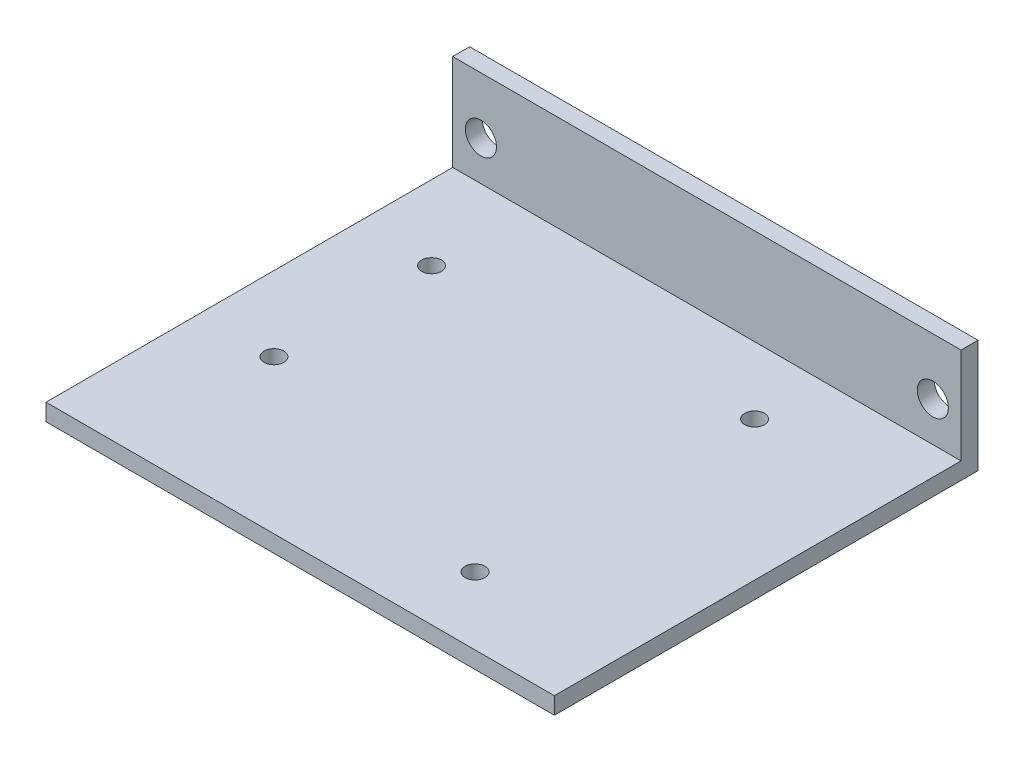
ISO-10303-21;
HEADER;
FILE_DESCRIPTION(('STEP AP214'),'2;1');
FILE_NAME('part.step','',(''),(''),'','','');
FILE_SCHEMA(('AUTOMOTIVE_DESIGN { 1 0 10303 214 1 1 1 1 }'));
ENDSEC;
DATA;
#1=APPLICATION_CONTEXT('core data for automotive mechanical design processes');
#2=APPLICATION_PROTOCOL_DEFINITION('international standard','automotive_design',2000,#1);
#3=PRODUCT_CONTEXT('',#1,'mechanical');
#4=PRODUCT('Part','Part','',(#3));
#5=PRODUCT_RELATED_PRODUCT_CATEGORY('part','',(#4));
#6=PRODUCT_DEFINITION_FORMATION('','',#4);
#7=PRODUCT_DEFINITION_CONTEXT('part definition',#1,'design');
#8=PRODUCT_DEFINITION('design','',#6,#7);
#9=PRODUCT_DEFINITION_SHAPE('','',#8);
#10=(LENGTH_UNIT() NAMED_UNIT(*) SI_UNIT(.MILLI.,.METRE.));
#11=(NAMED_UNIT(*) PLANE_ANGLE_UNIT() SI_UNIT($,.RADIAN.));
#12=(NAMED_UNIT(*) SI_UNIT($,.STERADIAN.) SOLID_ANGLE_UNIT());
#13=UNCERTAINTY_MEASURE_WITH_UNIT(LENGTH_MEASURE(1.E-05),#10,'distance_accuracy_value','');
#14=(GEOMETRIC_REPRESENTATION_CONTEXT(3) GLOBAL_UNCERTAINTY_ASSIGNED_CONTEXT((#13)) GLOBAL_UNIT_ASSIGNED_CONTEXT((#10,
#11,#12)) REPRESENTATION_CONTEXT('',''));
#15=CARTESIAN_POINT('',(0.,0.,0.));
#16=DIRECTION('',(0.,0.,1.));
#17=DIRECTION('',(1.,0.,0.));
#18=AXIS2_PLACEMENT_3D('',#15,#16,#17);
#19=CARTESIAN_POINT('',(45.,3.,-37.5));
#20=DIRECTION('',(-1.,0.,0.));
#21=DIRECTION('',(0.,0.,1.));
#22=AXIS2_PLACEMENT_3D('',#19,#20,#21);
#23=PLANE('',#22);
#24=DIRECTION('',(0.,0.,-1.));
#25=VECTOR('',#24,1.);
#26=CARTESIAN_POINT('',(45.,0.,-37.5));
#27=LINE('',#26,#25);
#28=CARTESIAN_POINT('',(45.,0.,37.5));
#29=VERTEX_POINT('',#28);
#30=CARTESIAN_POINT('',(45.,0.,-37.5));
#31=VERTEX_POINT('',#30);
#32=EDGE_CURVE('E100',#29,#31,#27,.T.);
#33=ORIENTED_EDGE('',*,*,#32,.T.);
#34=DIRECTION('',(0.,-1.,0.));
#35=VECTOR('',#34,1.);
#36=CARTESIAN_POINT('',(45.,3.,-37.5));
#37=LINE('',#36,#35);
#38=CARTESIAN_POINT('',(45.,20.,-37.5));
#39=VERTEX_POINT('',#38);
#40=EDGE_CURVE('E12',#39,#31,#37,.T.);
#41=ORIENTED_EDGE('',*,*,#40,.F.);
#42=DIRECTION('',(0.,0.,-1.));
#43=VECTOR('',#42,1.);
#44=CARTESIAN_POINT('',(45.,20.,-37.5));
#45=LINE('',#44,#43);
#46=CARTESIAN_POINT('',(45.,20.,-34.5));
#47=VERTEX_POINT('',#46);
#48=EDGE_CURVE('E107',#47,#39,#45,.T.);
#49=ORIENTED_EDGE('',*,*,#48,.F.);
#50=DIRECTION('',(0.,-1.,0.));
#51=VECTOR('',#50,1.);
#52=CARTESIAN_POINT('',(45.,130.049986118822,-34.5));
#53=LINE('',#52,#51);
#54=CARTESIAN_POINT('',(45.,3.,-34.5));
#55=VERTEX_POINT('',#54);
#56=EDGE_CURVE('E146',#47,#55,#53,.T.);
#57=ORIENTED_EDGE('',*,*,#56,.T.);
#58=DIRECTION('',(0.,0.,-1.));
#59=VECTOR('',#58,1.);
#60=CARTESIAN_POINT('',(45.,3.,-37.5));
#61=LINE('',#60,#59);
#62=CARTESIAN_POINT('',(45.,3.,37.5));
#63=VERTEX_POINT('',#62);
#64=EDGE_CURVE('E94',#63,#55,#61,.T.);
#65=ORIENTED_EDGE('',*,*,#64,.F.);
#66=DIRECTION('',(0.,-1.,0.));
#67=VECTOR('',#66,1.);
#68=CARTESIAN_POINT('',(45.,3.,37.5));
#69=LINE('',#68,#67);
#70=EDGE_CURVE('E86',#63,#29,#69,.T.);
#71=ORIENTED_EDGE('',*,*,#70,.T.);
#72=EDGE_LOOP('',(#33,#41,#49,#57,#65,#71));
#73=FACE_BOUND('',#72,.T.);
#74=ADVANCED_FACE('F41',(#73),#23,.F.);
#75=CARTESIAN_POINT('',(-45.,3.,-37.5));
#76=DIRECTION('',(0.,0.,1.));
#77=DIRECTION('',(1.,0.,0.));
#78=AXIS2_PLACEMENT_3D('',#75,#76,#77);
#79=PLANE('',#78);
#80=CARTESIAN_POINT('',(40.,9.99999999999998,-37.5));
#81=DIRECTION('',(0.,0.,-1.));
#82=DIRECTION('',(-1.,0.,0.));
#83=AXIS2_PLACEMENT_3D('',#80,#81,#82);
#84=CIRCLE('',#83,2.74999999999999);
#85=CARTESIAN_POINT('',(37.25,9.99999999999998,-37.5));
#86=VERTEX_POINT('',#85);
#87=EDGE_CURVE('E141',#86,#86,#84,.T.);
#88=ORIENTED_EDGE('',*,*,#87,.F.);
#89=EDGE_LOOP('',(#88));
#90=FACE_BOUND('',#89,.T.);
#91=CARTESIAN_POINT('',(-40.,9.99999999999999,-37.5));
#92=DIRECTION('',(0.,0.,-1.));
#93=DIRECTION('',(-1.,0.,0.));
#94=AXIS2_PLACEMENT_3D('',#91,#92,#93);
#95=CIRCLE('',#94,2.74999999999999);
#96=CARTESIAN_POINT('',(-42.75,9.99999999999999,-37.5));
#97=VERTEX_POINT('',#96);
#98=EDGE_CURVE('E128',#97,#97,#95,.T.);
#99=ORIENTED_EDGE('',*,*,#98,.F.);
#100=EDGE_LOOP('',(#99));
#101=FACE_BOUND('',#100,.T.);
#102=DIRECTION('',(-1.,0.,0.));
#103=VECTOR('',#102,1.);
#104=CARTESIAN_POINT('',(-45.,0.,-37.5));
#105=LINE('',#104,#103);
#106=CARTESIAN_POINT('',(-45.,0.,-37.5));
#107=VERTEX_POINT('',#106);
#108=EDGE_CURVE('E105',#31,#107,#105,.T.);
#109=ORIENTED_EDGE('',*,*,#108,.T.);
#110=DIRECTION('',(0.,-1.,0.));
#111=VECTOR('',#110,1.);
#112=CARTESIAN_POINT('',(-45.,3.,-37.5));
#113=LINE('',#112,#111);
#114=CARTESIAN_POINT('',(-45.,20.,-37.5));
#115=VERTEX_POINT('',#114);
#116=EDGE_CURVE('E50',#115,#107,#113,.T.);
#117=ORIENTED_EDGE('',*,*,#116,.F.);
#118=DIRECTION('',(-1.,0.,0.));
#119=VECTOR('',#118,1.);
#120=CARTESIAN_POINT('',(-45.,20.,-37.5));
#121=LINE('',#120,#119);
#122=EDGE_CURVE('E155',#39,#115,#121,.T.);
#123=ORIENTED_EDGE('',*,*,#122,.F.);
#124=ORIENTED_EDGE('',*,*,#40,.T.);
#125=EDGE_LOOP('',(#109,#117,#123,#124));
#126=FACE_BOUND('',#125,.T.);
#127=ADVANCED_FACE('F173',(#90,#101,#126),#79,.F.);
#128=CARTESIAN_POINT('',(-45.,3.,-37.5));
#129=DIRECTION('',(1.,0.,0.));
#130=DIRECTION('',(0.,0.,-1.));
#131=AXIS2_PLACEMENT_3D('',#128,#129,#130);
#132=PLANE('',#131);
#133=DIRECTION('',(0.,0.,1.));
#134=VECTOR('',#133,1.);
#135=CARTESIAN_POINT('',(-45.,0.,-37.5));
#136=LINE('',#135,#134);
#137=CARTESIAN_POINT('',(-45.,0.,37.5));
#138=VERTEX_POINT('',#137);
#139=EDGE_CURVE('E95',#107,#138,#136,.T.);
#140=ORIENTED_EDGE('',*,*,#139,.T.);
#141=DIRECTION('',(0.,-1.,0.));
#142=VECTOR('',#141,1.);
#143=CARTESIAN_POINT('',(-45.,3.,37.5));
#144=LINE('',#143,#142);
#145=CARTESIAN_POINT('',(-45.,3.,37.5));
#146=VERTEX_POINT('',#145);
#147=EDGE_CURVE('E89',#146,#138,#144,.T.);
#148=ORIENTED_EDGE('',*,*,#147,.F.);
#149=DIRECTION('',(0.,0.,1.));
#150=VECTOR('',#149,1.);
#151=CARTESIAN_POINT('',(-45.,3.,-37.5));
#152=LINE('',#151,#150);
#153=CARTESIAN_POINT('',(-45.,3.,-34.5));
#154=VERTEX_POINT('',#153);
#155=EDGE_CURVE('E162',#154,#146,#152,.T.);
#156=ORIENTED_EDGE('',*,*,#155,.F.);
#157=DIRECTION('',(0.,-1.,0.));
#158=VECTOR('',#157,1.);
#159=CARTESIAN_POINT('',(-45.,130.049986118822,-34.5));
#160=LINE('',#159,#158);
#161=CARTESIAN_POINT('',(-45.,20.,-34.5));
#162=VERTEX_POINT('',#161);
#163=EDGE_CURVE('E127',#162,#154,#160,.T.);
#164=ORIENTED_EDGE('',*,*,#163,.F.);
#165=DIRECTION('',(0.,0.,1.));
#166=VECTOR('',#165,1.);
#167=CARTESIAN_POINT('',(-45.,20.,-37.5));
#168=LINE('',#167,#166);
#169=EDGE_CURVE('E151',#115,#162,#168,.T.);
#170=ORIENTED_EDGE('',*,*,#169,.F.);
#171=ORIENTED_EDGE('',*,*,#116,.T.);
#172=EDGE_LOOP('',(#140,#148,#156,#164,#170,#171));
#173=FACE_BOUND('',#172,.T.);
#174=ADVANCED_FACE('F168',(#173),#132,.F.);
#175=CARTESIAN_POINT('',(-45.,3.,37.5));
#176=DIRECTION('',(0.,0.,-1.));
#177=DIRECTION('',(-1.,0.,0.));
#178=AXIS2_PLACEMENT_3D('',#175,#176,#177);
#179=PLANE('',#178);
#180=DIRECTION('',(1.,0.,0.));
#181=VECTOR('',#180,1.);
#182=CARTESIAN_POINT('',(-45.,0.,37.5));
#183=LINE('',#182,#181);
#184=EDGE_CURVE('E83',#138,#29,#183,.T.);
#185=ORIENTED_EDGE('',*,*,#184,.T.);
#186=ORIENTED_EDGE('',*,*,#70,.F.);
#187=DIRECTION('',(1.,0.,0.));
#188=VECTOR('',#187,1.);
#189=CARTESIAN_POINT('',(-45.,3.,37.5));
#190=LINE('',#189,#188);
#191=EDGE_CURVE('E64',#146,#63,#190,.T.);
#192=ORIENTED_EDGE('',*,*,#191,.F.);
#193=ORIENTED_EDGE('',*,*,#147,.T.);
#194=EDGE_LOOP('',(#185,#186,#192,#193));
#195=FACE_BOUND('',#194,.T.);
#196=ADVANCED_FACE('F85',(#195),#179,.F.);
#197=CARTESIAN_POINT('',(0.,3.,0.));
#198=DIRECTION('',(0.,1.,0.));
#199=DIRECTION('',(0.,0.,1.));
#200=AXIS2_PLACEMENT_3D('',#197,#198,#199);
#201=PLANE('',#200);
#202=CARTESIAN_POINT('',(20.3,3.,-22.65));
#203=DIRECTION('',(0.,1.,0.));
#204=DIRECTION('',(0.,0.,1.));
#205=AXIS2_PLACEMENT_3D('',#202,#203,#204);
#206=CIRCLE('',#205,1.75);
#207=CARTESIAN_POINT('',(20.3,3.,-20.9));
#208=VERTEX_POINT('',#207);
#209=EDGE_CURVE('E224',#208,#208,#206,.T.);
#210=ORIENTED_EDGE('',*,*,#209,.F.);
#211=EDGE_LOOP('',(#210));
#212=FACE_BOUND('',#211,.T.);
#213=CARTESIAN_POINT('',(-31.8,3.,-17.55));
#214=DIRECTION('',(0.,1.,0.));
#215=DIRECTION('',(0.,0.,1.));
#216=AXIS2_PLACEMENT_3D('',#213,#214,#215);
#217=CIRCLE('',#216,1.75);
#218=CARTESIAN_POINT('',(-31.8,3.,-15.8));
#219=VERTEX_POINT('',#218);
#220=EDGE_CURVE('E228',#219,#219,#217,.T.);
#221=ORIENTED_EDGE('',*,*,#220,.F.);
#222=EDGE_LOOP('',(#221));
#223=FACE_BOUND('',#222,.T.);
#224=CARTESIAN_POINT('',(19.,3.,25.55));
#225=DIRECTION('',(0.,1.,0.));
#226=DIRECTION('',(0.,0.,1.));
#227=AXIS2_PLACEMENT_3D('',#224,#225,#226);
#228=CIRCLE('',#227,1.75);
#229=CARTESIAN_POINT('',(19.,3.,27.3));
#230=VERTEX_POINT('',#229);
#231=EDGE_CURVE('E232',#230,#230,#228,.T.);
#232=ORIENTED_EDGE('',*,*,#231,.F.);
#233=EDGE_LOOP('',(#232));
#234=FACE_BOUND('',#233,.T.);
#235=CARTESIAN_POINT('',(-31.8,3.,10.35));
#236=DIRECTION('',(0.,1.,0.));
#237=DIRECTION('',(0.,0.,1.));
#238=AXIS2_PLACEMENT_3D('',#235,#236,#237);
#239=CIRCLE('',#238,1.75);
#240=CARTESIAN_POINT('',(-31.8,3.,12.1));
#241=VERTEX_POINT('',#240);
#242=EDGE_CURVE('E235',#241,#241,#239,.T.);
#243=ORIENTED_EDGE('',*,*,#242,.F.);
#244=EDGE_LOOP('',(#243));
#245=FACE_BOUND('',#244,.T.);
#246=DIRECTION('',(1.,0.,0.));
#247=VECTOR('',#246,1.);
#248=CARTESIAN_POINT('',(-45.,3.,-34.5));
#249=LINE('',#248,#247);
#250=EDGE_CURVE('E58',#154,#55,#249,.T.);
#251=ORIENTED_EDGE('',*,*,#250,.F.);
#252=ORIENTED_EDGE('',*,*,#155,.T.);
#253=ORIENTED_EDGE('',*,*,#191,.T.);
#254=ORIENTED_EDGE('',*,*,#64,.T.);
#255=EDGE_LOOP('',(#251,#252,#253,#254));
#256=FACE_BOUND('',#255,.T.);
#257=ADVANCED_FACE('F165',(#212,#223,#234,#245,#256),#201,.T.);
#258=CARTESIAN_POINT('',(0.,0.,0.));
#259=DIRECTION('',(0.,1.,0.));
#260=DIRECTION('',(0.,0.,1.));
#261=AXIS2_PLACEMENT_3D('',#258,#259,#260);
#262=PLANE('',#261);
#263=CARTESIAN_POINT('',(20.3,0.,-22.65));
#264=DIRECTION('',(0.,1.,0.));
#265=DIRECTION('',(0.,0.,1.));
#266=AXIS2_PLACEMENT_3D('',#263,#264,#265);
#267=CIRCLE('',#266,1.75);
#268=CARTESIAN_POINT('',(20.3,0.,-20.9));
#269=VERTEX_POINT('',#268);
#270=EDGE_CURVE('E247',#269,#269,#267,.F.);
#271=ORIENTED_EDGE('',*,*,#270,.F.);
#272=EDGE_LOOP('',(#271));
#273=FACE_BOUND('',#272,.T.);
#274=CARTESIAN_POINT('',(-31.8,0.,-17.55));
#275=DIRECTION('',(0.,1.,0.));
#276=DIRECTION('',(0.,0.,1.));
#277=AXIS2_PLACEMENT_3D('',#274,#275,#276);
#278=CIRCLE('',#277,1.75);
#279=CARTESIAN_POINT('',(-31.8,0.,-15.8));
#280=VERTEX_POINT('',#279);
#281=EDGE_CURVE('E253',#280,#280,#278,.F.);
#282=ORIENTED_EDGE('',*,*,#281,.F.);
#283=EDGE_LOOP('',(#282));
#284=FACE_BOUND('',#283,.T.);
#285=CARTESIAN_POINT('',(19.,0.,25.55));
#286=DIRECTION('',(0.,1.,0.));
#287=DIRECTION('',(0.,0.,1.));
#288=AXIS2_PLACEMENT_3D('',#285,#286,#287);
#289=CIRCLE('',#288,1.75);
#290=CARTESIAN_POINT('',(19.,0.,27.3));
#291=VERTEX_POINT('',#290);
#292=EDGE_CURVE('E239',#291,#291,#289,.F.);
#293=ORIENTED_EDGE('',*,*,#292,.F.);
#294=EDGE_LOOP('',(#293));
#295=FACE_BOUND('',#294,.T.);
#296=CARTESIAN_POINT('',(-31.8,0.,10.35));
#297=DIRECTION('',(0.,1.,0.));
#298=DIRECTION('',(0.,0.,1.));
#299=AXIS2_PLACEMENT_3D('',#296,#297,#298);
#300=CIRCLE('',#299,1.75);
#301=CARTESIAN_POINT('',(-31.8,0.,12.1));
#302=VERTEX_POINT('',#301);
#303=EDGE_CURVE('E238',#302,#302,#300,.F.);
#304=ORIENTED_EDGE('',*,*,#303,.F.);
#305=EDGE_LOOP('',(#304));
#306=FACE_BOUND('',#305,.T.);
#307=ORIENTED_EDGE('',*,*,#32,.F.);
#308=ORIENTED_EDGE('',*,*,#184,.F.);
#309=ORIENTED_EDGE('',*,*,#139,.F.);
#310=ORIENTED_EDGE('',*,*,#108,.F.);
#311=EDGE_LOOP('',(#307,#308,#309,#310));
#312=FACE_BOUND('',#311,.T.);
#313=ADVANCED_FACE('F104',(#273,#284,#295,#306,#312),#262,.F.);
#314=CARTESIAN_POINT('',(-45.,130.049986118822,-34.5));
#315=DIRECTION('',(0.,0.,-1.));
#316=DIRECTION('',(-1.,0.,0.));
#317=AXIS2_PLACEMENT_3D('',#314,#315,#316);
#318=PLANE('',#317);
#319=CARTESIAN_POINT('',(40.,9.99999999999998,-34.5));
#320=DIRECTION('',(0.,0.,-1.));
#321=DIRECTION('',(-1.,0.,0.));
#322=AXIS2_PLACEMENT_3D('',#319,#320,#321);
#323=CIRCLE('',#322,2.74999999999999);
#324=CARTESIAN_POINT('',(37.25,9.99999999999998,-34.5));
#325=VERTEX_POINT('',#324);
#326=EDGE_CURVE('E44',#325,#325,#323,.T.);
#327=ORIENTED_EDGE('',*,*,#326,.T.);
#328=EDGE_LOOP('',(#327));
#329=FACE_BOUND('',#328,.T.);
#330=CARTESIAN_POINT('',(-40.,9.99999999999999,-34.5));
#331=DIRECTION('',(0.,0.,-1.));
#332=DIRECTION('',(-1.,0.,0.));
#333=AXIS2_PLACEMENT_3D('',#330,#331,#332);
#334=CIRCLE('',#333,2.74999999999999);
#335=CARTESIAN_POINT('',(-42.75,9.99999999999999,-34.5));
#336=VERTEX_POINT('',#335);
#337=EDGE_CURVE('E124',#336,#336,#334,.T.);
#338=ORIENTED_EDGE('',*,*,#337,.T.);
#339=EDGE_LOOP('',(#338));
#340=FACE_BOUND('',#339,.T.);
#341=DIRECTION('',(1.,0.,0.));
#342=VECTOR('',#341,1.);
#343=CARTESIAN_POINT('',(-45.,20.,-34.5));
#344=LINE('',#343,#342);
#345=EDGE_CURVE('E113',#162,#47,#344,.T.);
#346=ORIENTED_EDGE('',*,*,#345,.F.);
#347=ORIENTED_EDGE('',*,*,#163,.T.);
#348=ORIENTED_EDGE('',*,*,#250,.T.);
#349=ORIENTED_EDGE('',*,*,#56,.F.);
#350=EDGE_LOOP('',(#346,#347,#348,#349));
#351=FACE_BOUND('',#350,.T.);
#352=ADVANCED_FACE('F186',(#329,#340,#351),#318,.F.);
#353=CARTESIAN_POINT('',(0.,20.,0.));
#354=DIRECTION('',(0.,1.,0.));
#355=DIRECTION('',(0.,0.,1.));
#356=AXIS2_PLACEMENT_3D('',#353,#354,#355);
#357=PLANE('',#356);
#358=ORIENTED_EDGE('',*,*,#122,.T.);
#359=ORIENTED_EDGE('',*,*,#169,.T.);
#360=ORIENTED_EDGE('',*,*,#345,.T.);
#361=ORIENTED_EDGE('',*,*,#48,.T.);
#362=EDGE_LOOP('',(#358,#359,#360,#361));
#363=FACE_BOUND('',#362,.T.);
#364=ADVANCED_FACE('F188',(#363),#357,.T.);
#365=CARTESIAN_POINT('',(-40.,9.99999999999999,-37.5));
#366=DIRECTION('',(0.,0.,-1.));
#367=DIRECTION('',(-1.,0.,0.));
#368=AXIS2_PLACEMENT_3D('',#365,#366,#367);
#369=CYLINDRICAL_SURFACE('',#368,2.74999999999999);
#370=ORIENTED_EDGE('',*,*,#98,.T.);
#371=EDGE_LOOP('',(#370));
#372=FACE_BOUND('',#371,.T.);
#373=ORIENTED_EDGE('',*,*,#337,.F.);
#374=EDGE_LOOP('',(#373));
#375=FACE_BOUND('',#374,.T.);
#376=ADVANCED_FACE('F190',(#372,#375),#369,.F.);
#377=CARTESIAN_POINT('',(40.,9.99999999999998,-37.5));
#378=DIRECTION('',(0.,0.,-1.));
#379=DIRECTION('',(-1.,0.,0.));
#380=AXIS2_PLACEMENT_3D('',#377,#378,#379);
#381=CYLINDRICAL_SURFACE('',#380,2.74999999999999);
#382=ORIENTED_EDGE('',*,*,#87,.T.);
#383=EDGE_LOOP('',(#382));
#384=FACE_BOUND('',#383,.T.);
#385=ORIENTED_EDGE('',*,*,#326,.F.);
#386=EDGE_LOOP('',(#385));
#387=FACE_BOUND('',#386,.T.);
#388=ADVANCED_FACE('F196',(#384,#387),#381,.F.);
#389=CARTESIAN_POINT('',(-31.8,-0.00100000000000013,10.35));
#390=DIRECTION('',(0.,1.,0.));
#391=DIRECTION('',(0.,0.,1.));
#392=AXIS2_PLACEMENT_3D('',#389,#390,#391);
#393=CYLINDRICAL_SURFACE('',#392,1.75);
#394=CARTESIAN_POINT('',(-31.8,3.,12.1));
#395=CARTESIAN_POINT('',(-31.8,2.96875,12.1));
#396=CARTESIAN_POINT('',(-31.8,2.9375,12.1));
#397=CARTESIAN_POINT('',(-31.8,2.875,12.1));
#398=CARTESIAN_POINT('',(-31.8,2.84375,12.1));
#399=CARTESIAN_POINT('',(-31.8,2.78125,12.1));
#400=CARTESIAN_POINT('',(-31.8,2.75,12.1));
#401=CARTESIAN_POINT('',(-31.8,2.6875,12.1));
#402=CARTESIAN_POINT('',(-31.8,2.65625,12.1));
#403=CARTESIAN_POINT('',(-31.8,2.59375,12.1));
#404=CARTESIAN_POINT('',(-31.8,2.5625,12.1));
#405=CARTESIAN_POINT('',(-31.8,2.5,12.1));
#406=CARTESIAN_POINT('',(-31.8,2.46875,12.1));
#407=CARTESIAN_POINT('',(-31.8,2.40625,12.1));
#408=CARTESIAN_POINT('',(-31.8,2.375,12.1));
#409=CARTESIAN_POINT('',(-31.8,2.3125,12.1));
#410=CARTESIAN_POINT('',(-31.8,2.28125,12.1));
#411=CARTESIAN_POINT('',(-31.8,2.21875,12.1));
#412=CARTESIAN_POINT('',(-31.8,2.1875,12.1));
#413=CARTESIAN_POINT('',(-31.8,2.125,12.1));
#414=CARTESIAN_POINT('',(-31.8,2.09375,12.1));
#415=CARTESIAN_POINT('',(-31.8,2.03125,12.1));
#416=CARTESIAN_POINT('',(-31.8,2.,12.1));
#417=CARTESIAN_POINT('',(-31.8,1.9375,12.1));
#418=CARTESIAN_POINT('',(-31.8,1.90625,12.1));
#419=CARTESIAN_POINT('',(-31.8,1.84375,12.1));
#420=CARTESIAN_POINT('',(-31.8,1.8125,12.1));
#421=CARTESIAN_POINT('',(-31.8,1.75,12.1));
#422=CARTESIAN_POINT('',(-31.8,1.71875,12.1));
#423=CARTESIAN_POINT('',(-31.8,1.65625,12.1));
#424=CARTESIAN_POINT('',(-31.8,1.625,12.1));
#425=CARTESIAN_POINT('',(-31.8,1.5625,12.1));
#426=CARTESIAN_POINT('',(-31.8,1.53125,12.1));
#427=CARTESIAN_POINT('',(-31.8,1.46875,12.1));
#428=CARTESIAN_POINT('',(-31.8,1.4375,12.1));
#429=CARTESIAN_POINT('',(-31.8,1.375,12.1));
#430=CARTESIAN_POINT('',(-31.8,1.34375,12.1));
#431=CARTESIAN_POINT('',(-31.8,1.28125,12.1));
#432=CARTESIAN_POINT('',(-31.8,1.25,12.1));
#433=CARTESIAN_POINT('',(-31.8,1.1875,12.1));
#434=CARTESIAN_POINT('',(-31.8,1.15625,12.1));
#435=CARTESIAN_POINT('',(-31.8,1.09375,12.1));
#436=CARTESIAN_POINT('',(-31.8,1.0625,12.1));
#437=CARTESIAN_POINT('',(-31.8,1.,12.1));
#438=CARTESIAN_POINT('',(-31.8,0.96875,12.1));
#439=CARTESIAN_POINT('',(-31.8,0.90625,12.1));
#440=CARTESIAN_POINT('',(-31.8,0.875,12.1));
#441=CARTESIAN_POINT('',(-31.8,0.8125,12.1));
#442=CARTESIAN_POINT('',(-31.8,0.78125,12.1));
#443=CARTESIAN_POINT('',(-31.8,0.71875,12.1));
#444=CARTESIAN_POINT('',(-31.8,0.6875,12.1));
#445=CARTESIAN_POINT('',(-31.8,0.625,12.1));
#446=CARTESIAN_POINT('',(-31.8,0.59375,12.1));
#447=CARTESIAN_POINT('',(-31.8,0.53125,12.1));
#448=CARTESIAN_POINT('',(-31.8,0.5,12.1));
#449=CARTESIAN_POINT('',(-31.8,0.4375,12.1));
#450=CARTESIAN_POINT('',(-31.8,0.40625,12.1));
#451=CARTESIAN_POINT('',(-31.8,0.34375,12.1));
#452=CARTESIAN_POINT('',(-31.8,0.3125,12.1));
#453=CARTESIAN_POINT('',(-31.8,0.25,12.1));
#454=CARTESIAN_POINT('',(-31.8,0.21875,12.1));
#455=CARTESIAN_POINT('',(-31.8,0.15625,12.1));
#456=CARTESIAN_POINT('',(-31.8,0.125,12.1));
#457=CARTESIAN_POINT('',(-31.8,0.0625000000000001,12.1));
#458=CARTESIAN_POINT('',(-31.8,0.0312500000000001,12.1));
#459=CARTESIAN_POINT('',(-31.8,0.,12.1));
#460=B_SPLINE_CURVE_WITH_KNOTS('',3,(#394,#395,#396,#397,#398,#399,#400,#401,#402,#403,#404,
#405,#406,#407,#408,#409,#410,#411,#412,#413,#414,#415,#416,#417,#418,#419,#420,#421,#422,#423,
#424,#425,#426,#427,#428,#429,#430,#431,#432,#433,#434,#435,#436,#437,#438,#439,#440,#441,#442,
#443,#444,#445,#446,#447,#448,#449,#450,#451,#452,#453,#454,#455,#456,#457,#458,#459),
.UNSPECIFIED.,.F.,.F.,(4,2,2,2,2,2,2,2,2,2,2,2,2,2,2,2,2,2,2,2,2,2,2,2,2,2,2,2,2,2,2,2,4),(0.,
0.0937500000000001,0.1875,0.28125,0.375,0.46875,0.5625,0.65625,0.75,0.84375,0.9375,1.03125,
1.125,1.21875,1.3125,1.40625,1.5,1.59375,1.6875,1.78125,1.875,1.96875,2.0625,2.15625,2.25,
2.34375,2.4375,2.53125,2.625,2.71875,2.8125,2.90625,3.),.UNSPECIFIED.);
#461=EDGE_CURVE('BSEAM265',#241,#302,#460,.T.);
#462=ORIENTED_EDGE('',*,*,#242,.T.);
#463=ORIENTED_EDGE('',*,*,#303,.T.);
#464=ORIENTED_EDGE('',*,*,#461,.T.);
#465=ORIENTED_EDGE('',*,*,#461,.F.);
#466=EDGE_LOOP('',(#462,#464,#463,#465));
#467=FACE_BOUND('',#466,.T.);
#468=ADVANCED_FACE('F265',(#467),#393,.F.);
#469=CARTESIAN_POINT('',(19.,-0.00100000000000013,25.55));
#470=DIRECTION('',(0.,1.,0.));
#471=DIRECTION('',(0.,0.,1.));
#472=AXIS2_PLACEMENT_3D('',#469,#470,#471);
#473=CYLINDRICAL_SURFACE('',#472,1.75);
#474=CARTESIAN_POINT('',(19.,3.,27.3));
#475=CARTESIAN_POINT('',(19.,2.96875,27.3));
#476=CARTESIAN_POINT('',(19.,2.9375,27.3));
#477=CARTESIAN_POINT('',(19.,2.875,27.3));
#478=CARTESIAN_POINT('',(19.,2.84375,27.3));
#479=CARTESIAN_POINT('',(19.,2.78125,27.3));
#480=CARTESIAN_POINT('',(19.,2.75,27.3));
#481=CARTESIAN_POINT('',(19.,2.6875,27.3));
#482=CARTESIAN_POINT('',(19.,2.65625,27.3));
#483=CARTESIAN_POINT('',(19.,2.59375,27.3));
#484=CARTESIAN_POINT('',(19.,2.5625,27.3));
#485=CARTESIAN_POINT('',(19.,2.5,27.3));
#486=CARTESIAN_POINT('',(19.,2.46875,27.3));
#487=CARTESIAN_POINT('',(19.,2.40625,27.3));
#488=CARTESIAN_POINT('',(19.,2.375,27.3));
#489=CARTESIAN_POINT('',(19.,2.3125,27.3));
#490=CARTESIAN_POINT('',(19.,2.28125,27.3));
#491=CARTESIAN_POINT('',(19.,2.21875,27.3));
#492=CARTESIAN_POINT('',(19.,2.1875,27.3));
#493=CARTESIAN_POINT('',(19.,2.125,27.3));
#494=CARTESIAN_POINT('',(19.,2.09375,27.3));
#495=CARTESIAN_POINT('',(19.,2.03125,27.3));
#496=CARTESIAN_POINT('',(19.,2.,27.3));
#497=CARTESIAN_POINT('',(19.,1.9375,27.3));
#498=CARTESIAN_POINT('',(19.,1.90625,27.3));
#499=CARTESIAN_POINT('',(19.,1.84375,27.3));
#500=CARTESIAN_POINT('',(19.,1.8125,27.3));
#501=CARTESIAN_POINT('',(19.,1.75,27.3));
#502=CARTESIAN_POINT('',(19.,1.71875,27.3));
#503=CARTESIAN_POINT('',(19.,1.65625,27.3));
#504=CARTESIAN_POINT('',(19.,1.625,27.3));
#505=CARTESIAN_POINT('',(19.,1.5625,27.3));
#506=CARTESIAN_POINT('',(19.,1.53125,27.3));
#507=CARTESIAN_POINT('',(19.,1.46875,27.3));
#508=CARTESIAN_POINT('',(19.,1.4375,27.3));
#509=CARTESIAN_POINT('',(19.,1.375,27.3));
#510=CARTESIAN_POINT('',(19.,1.34375,27.3));
#511=CARTESIAN_POINT('',(19.,1.28125,27.3));
#512=CARTESIAN_POINT('',(19.,1.25,27.3));
#513=CARTESIAN_POINT('',(19.,1.1875,27.3));
#514=CARTESIAN_POINT('',(19.,1.15625,27.3));
#515=CARTESIAN_POINT('',(19.,1.09375,27.3));
#516=CARTESIAN_POINT('',(19.,1.0625,27.3));
#517=CARTESIAN_POINT('',(19.,1.,27.3));
#518=CARTESIAN_POINT('',(19.,0.96875,27.3));
#519=CARTESIAN_POINT('',(19.,0.90625,27.3));
#520=CARTESIAN_POINT('',(19.,0.875,27.3));
#521=CARTESIAN_POINT('',(19.,0.8125,27.3));
#522=CARTESIAN_POINT('',(19.,0.78125,27.3));
#523=CARTESIAN_POINT('',(19.,0.71875,27.3));
#524=CARTESIAN_POINT('',(19.,0.6875,27.3));
#525=CARTESIAN_POINT('',(19.,0.625,27.3));
#526=CARTESIAN_POINT('',(19.,0.59375,27.3));
#527=CARTESIAN_POINT('',(19.,0.53125,27.3));
#528=CARTESIAN_POINT('',(19.,0.5,27.3));
#529=CARTESIAN_POINT('',(19.,0.4375,27.3));
#530=CARTESIAN_POINT('',(19.,0.40625,27.3));
#531=CARTESIAN_POINT('',(19.,0.34375,27.3));
#532=CARTESIAN_POINT('',(19.,0.3125,27.3));
#533=CARTESIAN_POINT('',(19.,0.25,27.3));
#534=CARTESIAN_POINT('',(19.,0.21875,27.3));
#535=CARTESIAN_POINT('',(19.,0.15625,27.3));
#536=CARTESIAN_POINT('',(19.,0.125,27.3));
#537=CARTESIAN_POINT('',(19.,0.0625000000000001,27.3));
#538=CARTESIAN_POINT('',(19.,0.0312500000000001,27.3));
#539=CARTESIAN_POINT('',(19.,0.,27.3));
#540=B_SPLINE_CURVE_WITH_KNOTS('',3,(#474,#475,#476,#477,#478,#479,#480,#481,#482,#483,#484,
#485,#486,#487,#488,#489,#490,#491,#492,#493,#494,#495,#496,#497,#498,#499,#500,#501,#502,#503,
#504,#505,#506,#507,#508,#509,#510,#511,#512,#513,#514,#515,#516,#517,#518,#519,#520,#521,#522,
#523,#524,#525,#526,#527,#528,#529,#530,#531,#532,#533,#534,#535,#536,#537,#538,#539),
.UNSPECIFIED.,.F.,.F.,(4,2,2,2,2,2,2,2,2,2,2,2,2,2,2,2,2,2,2,2,2,2,2,2,2,2,2,2,2,2,2,2,4),(0.,
0.0937500000000001,0.1875,0.28125,0.375,0.46875,0.5625,0.65625,0.75,0.84375,0.9375,1.03125,
1.125,1.21875,1.3125,1.40625,1.5,1.59375,1.6875,1.78125,1.875,1.96875,2.0625,2.15625,2.25,
2.34375,2.4375,2.53125,2.625,2.71875,2.8125,2.90625,3.),.UNSPECIFIED.);
#541=EDGE_CURVE('BSEAM261',#230,#291,#540,.T.);
#542=ORIENTED_EDGE('',*,*,#231,.T.);
#543=ORIENTED_EDGE('',*,*,#292,.T.);
#544=ORIENTED_EDGE('',*,*,#541,.T.);
#545=ORIENTED_EDGE('',*,*,#541,.F.);
#546=EDGE_LOOP('',(#542,#544,#543,#545));
#547=FACE_BOUND('',#546,.T.);
#548=ADVANCED_FACE('F261',(#547),#473,.F.);
#549=CARTESIAN_POINT('',(-31.8,-0.00100000000000013,-17.55));
#550=DIRECTION('',(0.,1.,0.));
#551=DIRECTION('',(0.,0.,1.));
#552=AXIS2_PLACEMENT_3D('',#549,#550,#551);
#553=CYLINDRICAL_SURFACE('',#552,1.75);
#554=CARTESIAN_POINT('',(-31.8,3.,-15.8));
#555=CARTESIAN_POINT('',(-31.8,2.96875,-15.8));
#556=CARTESIAN_POINT('',(-31.8,2.9375,-15.8));
#557=CARTESIAN_POINT('',(-31.8,2.875,-15.8));
#558=CARTESIAN_POINT('',(-31.8,2.84375,-15.8));
#559=CARTESIAN_POINT('',(-31.8,2.78125,-15.8));
#560=CARTESIAN_POINT('',(-31.8,2.75,-15.8));
#561=CARTESIAN_POINT('',(-31.8,2.6875,-15.8));
#562=CARTESIAN_POINT('',(-31.8,2.65625,-15.8));
#563=CARTESIAN_POINT('',(-31.8,2.59375,-15.8));
#564=CARTESIAN_POINT('',(-31.8,2.5625,-15.8));
#565=CARTESIAN_POINT('',(-31.8,2.5,-15.8));
#566=CARTESIAN_POINT('',(-31.8,2.46875,-15.8));
#567=CARTESIAN_POINT('',(-31.8,2.40625,-15.8));
#568=CARTESIAN_POINT('',(-31.8,2.375,-15.8));
#569=CARTESIAN_POINT('',(-31.8,2.3125,-15.8));
#570=CARTESIAN_POINT('',(-31.8,2.28125,-15.8));
#571=CARTESIAN_POINT('',(-31.8,2.21875,-15.8));
#572=CARTESIAN_POINT('',(-31.8,2.1875,-15.8));
#573=CARTESIAN_POINT('',(-31.8,2.125,-15.8));
#574=CARTESIAN_POINT('',(-31.8,2.09375,-15.8));
#575=CARTESIAN_POINT('',(-31.8,2.03125,-15.8));
#576=CARTESIAN_POINT('',(-31.8,2.,-15.8));
#577=CARTESIAN_POINT('',(-31.8,1.9375,-15.8));
#578=CARTESIAN_POINT('',(-31.8,1.90625,-15.8));
#579=CARTESIAN_POINT('',(-31.8,1.84375,-15.8));
#580=CARTESIAN_POINT('',(-31.8,1.8125,-15.8));
#581=CARTESIAN_POINT('',(-31.8,1.75,-15.8));
#582=CARTESIAN_POINT('',(-31.8,1.71875,-15.8));
#583=CARTESIAN_POINT('',(-31.8,1.65625,-15.8));
#584=CARTESIAN_POINT('',(-31.8,1.625,-15.8));
#585=CARTESIAN_POINT('',(-31.8,1.5625,-15.8));
#586=CARTESIAN_POINT('',(-31.8,1.53125,-15.8));
#587=CARTESIAN_POINT('',(-31.8,1.46875,-15.8));
#588=CARTESIAN_POINT('',(-31.8,1.4375,-15.8));
#589=CARTESIAN_POINT('',(-31.8,1.375,-15.8));
#590=CARTESIAN_POINT('',(-31.8,1.34375,-15.8));
#591=CARTESIAN_POINT('',(-31.8,1.28125,-15.8));
#592=CARTESIAN_POINT('',(-31.8,1.25,-15.8));
#593=CARTESIAN_POINT('',(-31.8,1.1875,-15.8));
#594=CARTESIAN_POINT('',(-31.8,1.15625,-15.8));
#595=CARTESIAN_POINT('',(-31.8,1.09375,-15.8));
#596=CARTESIAN_POINT('',(-31.8,1.0625,-15.8));
#597=CARTESIAN_POINT('',(-31.8,1.,-15.8));
#598=CARTESIAN_POINT('',(-31.8,0.96875,-15.8));
#599=CARTESIAN_POINT('',(-31.8,0.90625,-15.8));
#600=CARTESIAN_POINT('',(-31.8,0.875,-15.8));
#601=CARTESIAN_POINT('',(-31.8,0.8125,-15.8));
#602=CARTESIAN_POINT('',(-31.8,0.78125,-15.8));
#603=CARTESIAN_POINT('',(-31.8,0.71875,-15.8));
#604=CARTESIAN_POINT('',(-31.8,0.6875,-15.8));
#605=CARTESIAN_POINT('',(-31.8,0.625,-15.8));
#606=CARTESIAN_POINT('',(-31.8,0.59375,-15.8));
#607=CARTESIAN_POINT('',(-31.8,0.53125,-15.8));
#608=CARTESIAN_POINT('',(-31.8,0.5,-15.8));
#609=CARTESIAN_POINT('',(-31.8,0.4375,-15.8));
#610=CARTESIAN_POINT('',(-31.8,0.40625,-15.8));
#611=CARTESIAN_POINT('',(-31.8,0.34375,-15.8));
#612=CARTESIAN_POINT('',(-31.8,0.3125,-15.8));
#613=CARTESIAN_POINT('',(-31.8,0.25,-15.8));
#614=CARTESIAN_POINT('',(-31.8,0.21875,-15.8));
#615=CARTESIAN_POINT('',(-31.8,0.15625,-15.8));
#616=CARTESIAN_POINT('',(-31.8,0.125,-15.8));
#617=CARTESIAN_POINT('',(-31.8,0.0625000000000001,-15.8));
#618=CARTESIAN_POINT('',(-31.8,0.0312500000000001,-15.8));
#619=CARTESIAN_POINT('',(-31.8,0.,-15.8));
#620=B_SPLINE_CURVE_WITH_KNOTS('',3,(#554,#555,#556,#557,#558,#559,#560,#561,#562,#563,#564,
#565,#566,#567,#568,#569,#570,#571,#572,#573,#574,#575,#576,#577,#578,#579,#580,#581,#582,#583,
#584,#585,#586,#587,#588,#589,#590,#591,#592,#593,#594,#595,#596,#597,#598,#599,#600,#601,#602,
#603,#604,#605,#606,#607,#608,#609,#610,#611,#612,#613,#614,#615,#616,#617,#618,#619),
.UNSPECIFIED.,.F.,.F.,(4,2,2,2,2,2,2,2,2,2,2,2,2,2,2,2,2,2,2,2,2,2,2,2,2,2,2,2,2,2,2,2,4),(0.,
0.0937500000000001,0.1875,0.28125,0.375,0.46875,0.5625,0.65625,0.75,0.84375,0.9375,1.03125,
1.125,1.21875,1.3125,1.40625,1.5,1.59375,1.6875,1.78125,1.875,1.96875,2.0625,2.15625,2.25,
2.34375,2.4375,2.53125,2.625,2.71875,2.8125,2.90625,3.),.UNSPECIFIED.);
#621=EDGE_CURVE('BSEAM264',#219,#280,#620,.T.);
#622=ORIENTED_EDGE('',*,*,#220,.T.);
#623=ORIENTED_EDGE('',*,*,#281,.T.);
#624=ORIENTED_EDGE('',*,*,#621,.T.);
#625=ORIENTED_EDGE('',*,*,#621,.F.);
#626=EDGE_LOOP('',(#622,#624,#623,#625));
#627=FACE_BOUND('',#626,.T.);
#628=ADVANCED_FACE('F264',(#627),#553,.F.);
#629=CARTESIAN_POINT('',(20.3,-0.00100000000000013,-22.65));
#630=DIRECTION('',(0.,1.,0.));
#631=DIRECTION('',(0.,0.,1.));
#632=AXIS2_PLACEMENT_3D('',#629,#630,#631);
#633=CYLINDRICAL_SURFACE('',#632,1.75);
#634=CARTESIAN_POINT('',(20.3,3.,-20.9));
#635=CARTESIAN_POINT('',(20.3,2.96875,-20.9));
#636=CARTESIAN_POINT('',(20.3,2.9375,-20.9));
#637=CARTESIAN_POINT('',(20.3,2.875,-20.9));
#638=CARTESIAN_POINT('',(20.3,2.84375,-20.9));
#639=CARTESIAN_POINT('',(20.3,2.78125,-20.9));
#640=CARTESIAN_POINT('',(20.3,2.75,-20.9));
#641=CARTESIAN_POINT('',(20.3,2.6875,-20.9));
#642=CARTESIAN_POINT('',(20.3,2.65625,-20.9));
#643=CARTESIAN_POINT('',(20.3,2.59375,-20.9));
#644=CARTESIAN_POINT('',(20.3,2.5625,-20.9));
#645=CARTESIAN_POINT('',(20.3,2.5,-20.9));
#646=CARTESIAN_POINT('',(20.3,2.46875,-20.9));
#647=CARTESIAN_POINT('',(20.3,2.40625,-20.9));
#648=CARTESIAN_POINT('',(20.3,2.375,-20.9));
#649=CARTESIAN_POINT('',(20.3,2.3125,-20.9));
#650=CARTESIAN_POINT('',(20.3,2.28125,-20.9));
#651=CARTESIAN_POINT('',(20.3,2.21875,-20.9));
#652=CARTESIAN_POINT('',(20.3,2.1875,-20.9));
#653=CARTESIAN_POINT('',(20.3,2.125,-20.9));
#654=CARTESIAN_POINT('',(20.3,2.09375,-20.9));
#655=CARTESIAN_POINT('',(20.3,2.03125,-20.9));
#656=CARTESIAN_POINT('',(20.3,2.,-20.9));
#657=CARTESIAN_POINT('',(20.3,1.9375,-20.9));
#658=CARTESIAN_POINT('',(20.3,1.90625,-20.9));
#659=CARTESIAN_POINT('',(20.3,1.84375,-20.9));
#660=CARTESIAN_POINT('',(20.3,1.8125,-20.9));
#661=CARTESIAN_POINT('',(20.3,1.75,-20.9));
#662=CARTESIAN_POINT('',(20.3,1.71875,-20.9));
#663=CARTESIAN_POINT('',(20.3,1.65625,-20.9));
#664=CARTESIAN_POINT('',(20.3,1.625,-20.9));
#665=CARTESIAN_POINT('',(20.3,1.5625,-20.9));
#666=CARTESIAN_POINT('',(20.3,1.53125,-20.9));
#667=CARTESIAN_POINT('',(20.3,1.46875,-20.9));
#668=CARTESIAN_POINT('',(20.3,1.4375,-20.9));
#669=CARTESIAN_POINT('',(20.3,1.375,-20.9));
#670=CARTESIAN_POINT('',(20.3,1.34375,-20.9));
#671=CARTESIAN_POINT('',(20.3,1.28125,-20.9));
#672=CARTESIAN_POINT('',(20.3,1.25,-20.9));
#673=CARTESIAN_POINT('',(20.3,1.1875,-20.9));
#674=CARTESIAN_POINT('',(20.3,1.15625,-20.9));
#675=CARTESIAN_POINT('',(20.3,1.09375,-20.9));
#676=CARTESIAN_POINT('',(20.3,1.0625,-20.9));
#677=CARTESIAN_POINT('',(20.3,1.,-20.9));
#678=CARTESIAN_POINT('',(20.3,0.96875,-20.9));
#679=CARTESIAN_POINT('',(20.3,0.90625,-20.9));
#680=CARTESIAN_POINT('',(20.3,0.875,-20.9));
#681=CARTESIAN_POINT('',(20.3,0.8125,-20.9));
#682=CARTESIAN_POINT('',(20.3,0.78125,-20.9));
#683=CARTESIAN_POINT('',(20.3,0.71875,-20.9));
#684=CARTESIAN_POINT('',(20.3,0.6875,-20.9));
#685=CARTESIAN_POINT('',(20.3,0.625,-20.9));
#686=CARTESIAN_POINT('',(20.3,0.59375,-20.9));
#687=CARTESIAN_POINT('',(20.3,0.53125,-20.9));
#688=CARTESIAN_POINT('',(20.3,0.5,-20.9));
#689=CARTESIAN_POINT('',(20.3,0.4375,-20.9));
#690=CARTESIAN_POINT('',(20.3,0.40625,-20.9));
#691=CARTESIAN_POINT('',(20.3,0.34375,-20.9));
#692=CARTESIAN_POINT('',(20.3,0.3125,-20.9));
#693=CARTESIAN_POINT('',(20.3,0.25,-20.9));
#694=CARTESIAN_POINT('',(20.3,0.21875,-20.9));
#695=CARTESIAN_POINT('',(20.3,0.15625,-20.9));
#696=CARTESIAN_POINT('',(20.3,0.125,-20.9));
#697=CARTESIAN_POINT('',(20.3,0.0625000000000001,-20.9));
#698=CARTESIAN_POINT('',(20.3,0.0312500000000001,-20.9));
#699=CARTESIAN_POINT('',(20.3,0.,-20.9));
#700=B_SPLINE_CURVE_WITH_KNOTS('',3,(#634,#635,#636,#637,#638,#639,#640,#641,#642,#643,#644,
#645,#646,#647,#648,#649,#650,#651,#652,#653,#654,#655,#656,#657,#658,#659,#660,#661,#662,#663,
#664,#665,#666,#667,#668,#669,#670,#671,#672,#673,#674,#675,#676,#677,#678,#679,#680,#681,#682,
#683,#684,#685,#686,#687,#688,#689,#690,#691,#692,#693,#694,#695,#696,#697,#698,#699),
.UNSPECIFIED.,.F.,.F.,(4,2,2,2,2,2,2,2,2,2,2,2,2,2,2,2,2,2,2,2,2,2,2,2,2,2,2,2,2,2,2,2,4),(0.,
0.0937500000000001,0.1875,0.28125,0.375,0.46875,0.5625,0.65625,0.75,0.84375,0.9375,1.03125,
1.125,1.21875,1.3125,1.40625,1.5,1.59375,1.6875,1.78125,1.875,1.96875,2.0625,2.15625,2.25,
2.34375,2.4375,2.53125,2.625,2.71875,2.8125,2.90625,3.),.UNSPECIFIED.);
#701=EDGE_CURVE('BSEAM280',#208,#269,#700,.T.);
#702=ORIENTED_EDGE('',*,*,#209,.T.);
#703=ORIENTED_EDGE('',*,*,#270,.T.);
#704=ORIENTED_EDGE('',*,*,#701,.T.);
#705=ORIENTED_EDGE('',*,*,#701,.F.);
#706=EDGE_LOOP('',(#702,#704,#703,#705));
#707=FACE_BOUND('',#706,.T.);
#708=ADVANCED_FACE('F280',(#707),#633,.F.);
#709=CLOSED_SHELL('',(#74,#127,#174,#196,#257,#313,#352,#364,#376,#388,#468,#548,#628,#708));
#710=MANIFOLD_SOLID_BREP('B2',#709);
#711=ADVANCED_BREP_SHAPE_REPRESENTATION('',(#18,#710),#14);
#712=SHAPE_DEFINITION_REPRESENTATION(#9,#711);
ENDSEC;
END-ISO-10303-21;
